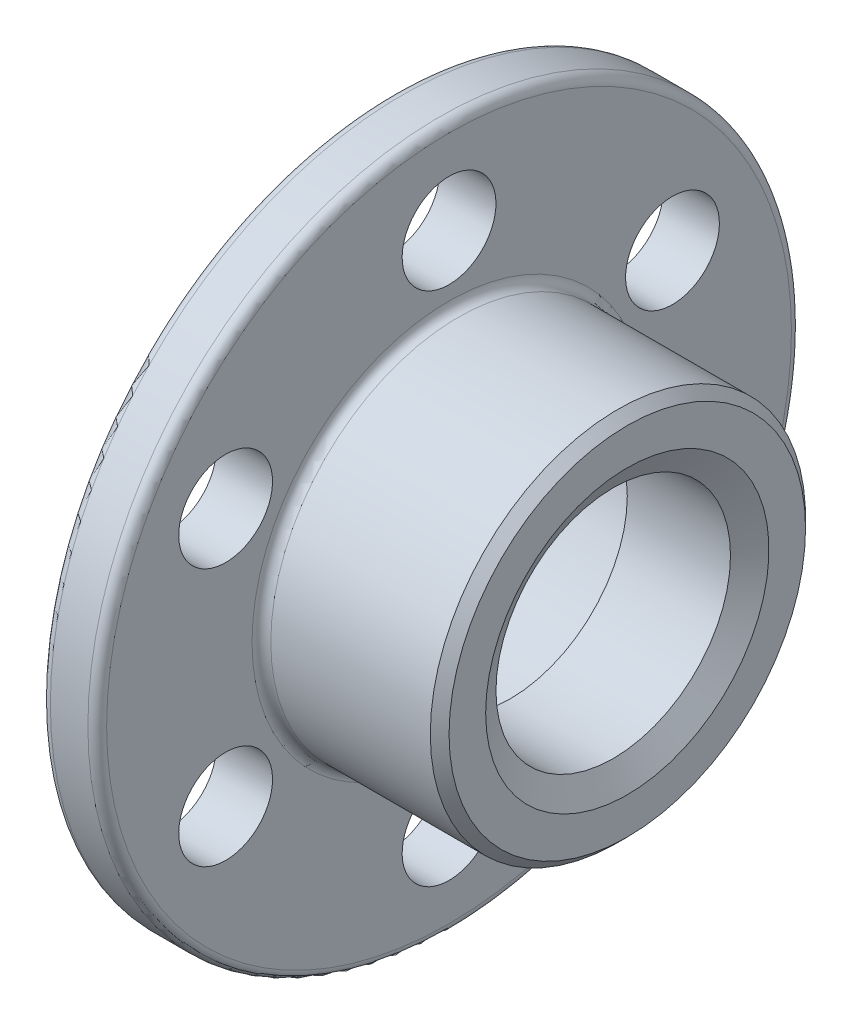
ISO-10303-21;
HEADER;
FILE_DESCRIPTION(('STEP AP214'),'2;1');
FILE_NAME('part.step','',(''),(''),'','','');
FILE_SCHEMA(('AUTOMOTIVE_DESIGN { 1 0 10303 214 1 1 1 1 }'));
ENDSEC;
DATA;
#1=APPLICATION_CONTEXT('core data for automotive mechanical design processes');
#2=APPLICATION_PROTOCOL_DEFINITION('international standard','automotive_design',2000,#1);
#3=PRODUCT_CONTEXT('',#1,'mechanical');
#4=PRODUCT('Part','Part','',(#3));
#5=PRODUCT_RELATED_PRODUCT_CATEGORY('part','',(#4));
#6=PRODUCT_DEFINITION_FORMATION('','',#4);
#7=PRODUCT_DEFINITION_CONTEXT('part definition',#1,'design');
#8=PRODUCT_DEFINITION('design','',#6,#7);
#9=PRODUCT_DEFINITION_SHAPE('','',#8);
#10=(LENGTH_UNIT() NAMED_UNIT(*) SI_UNIT(.MILLI.,.METRE.));
#11=(NAMED_UNIT(*) PLANE_ANGLE_UNIT() SI_UNIT($,.RADIAN.));
#12=(NAMED_UNIT(*) SI_UNIT($,.STERADIAN.) SOLID_ANGLE_UNIT());
#13=UNCERTAINTY_MEASURE_WITH_UNIT(LENGTH_MEASURE(1.E-05),#10,'distance_accuracy_value','');
#14=(GEOMETRIC_REPRESENTATION_CONTEXT(3) GLOBAL_UNCERTAINTY_ASSIGNED_CONTEXT((#13)) GLOBAL_UNIT_ASSIGNED_CONTEXT((#10,
#11,#12)) REPRESENTATION_CONTEXT('',''));
#15=CARTESIAN_POINT('',(0.,0.,0.));
#16=DIRECTION('',(0.,0.,1.));
#17=DIRECTION('',(1.,0.,0.));
#18=AXIS2_PLACEMENT_3D('',#15,#16,#17);
#19=CARTESIAN_POINT('',(0.,75.,0.));
#20=DIRECTION('',(1.,0.,0.));
#21=DIRECTION('',(0.,0.,-1.));
#22=AXIS2_PLACEMENT_3D('',#19,#20,#21);
#23=PLANE('',#22);
#24=CARTESIAN_POINT('',(0.,0.,0.));
#25=DIRECTION('',(1.,0.,0.));
#26=DIRECTION('',(0.,0.,-1.));
#27=AXIS2_PLACEMENT_3D('',#24,#25,#26);
#28=CIRCLE('',#27,73.);
#29=CARTESIAN_POINT('',(0.,0.,-73.));
#30=VERTEX_POINT('',#29);
#31=EDGE_CURVE('E66',#30,#30,#28,.F.);
#32=ORIENTED_EDGE('',*,*,#31,.T.);
#33=EDGE_LOOP('',(#32));
#34=FACE_BOUND('',#33,.T.);
#35=CARTESIAN_POINT('',(0.,-27.4999999999996,47.6313972081444));
#36=DIRECTION('',(-1.,0.,0.));
#37=DIRECTION('',(0.,0.499999999999992,-0.866025403784443));
#38=AXIS2_PLACEMENT_3D('',#35,#36,#37);
#39=CIRCLE('',#38,9.99999999999999);
#40=CARTESIAN_POINT('',(0.,-22.4999999999996,38.9711431703));
#41=VERTEX_POINT('',#40);
#42=EDGE_CURVE('E120',#41,#41,#39,.T.);
#43=ORIENTED_EDGE('',*,*,#42,.F.);
#44=EDGE_LOOP('',(#43));
#45=FACE_BOUND('',#44,.T.);
#46=CARTESIAN_POINT('',(0.,-27.5000000000002,-47.631397208144));
#47=DIRECTION('',(-1.,0.,0.));
#48=DIRECTION('',(0.,0.500000000000004,0.866025403784436));
#49=AXIS2_PLACEMENT_3D('',#46,#47,#48);
#50=CIRCLE('',#49,9.99999999999999);
#51=CARTESIAN_POINT('',(0.,-22.5000000000002,-38.9711431702997));
#52=VERTEX_POINT('',#51);
#53=EDGE_CURVE('E108',#52,#52,#50,.T.);
#54=ORIENTED_EDGE('',*,*,#53,.F.);
#55=EDGE_LOOP('',(#54));
#56=FACE_BOUND('',#55,.T.);
#57=CARTESIAN_POINT('',(0.,55.,0.));
#58=DIRECTION('',(-1.,0.,0.));
#59=DIRECTION('',(0.,-1.,0.));
#60=AXIS2_PLACEMENT_3D('',#57,#58,#59);
#61=CIRCLE('',#60,9.99999999999999);
#62=CARTESIAN_POINT('',(0.,45.,0.));
#63=VERTEX_POINT('',#62);
#64=EDGE_CURVE('E96',#63,#63,#61,.T.);
#65=ORIENTED_EDGE('',*,*,#64,.F.);
#66=EDGE_LOOP('',(#65));
#67=FACE_BOUND('',#66,.T.);
#68=CARTESIAN_POINT('',(0.,0.,0.));
#69=DIRECTION('',(-1.,0.,0.));
#70=DIRECTION('',(0.,0.,1.));
#71=AXIS2_PLACEMENT_3D('',#68,#69,#70);
#72=CIRCLE('',#71,35.);
#73=CARTESIAN_POINT('',(0.,0.,35.));
#74=VERTEX_POINT('',#73);
#75=EDGE_CURVE('E84',#74,#74,#72,.T.);
#76=ORIENTED_EDGE('',*,*,#75,.F.);
#77=EDGE_LOOP('',(#76));
#78=FACE_BOUND('',#77,.T.);
#79=CARTESIAN_POINT('',(0.,27.4999999999999,-47.6313972081442));
#80=DIRECTION('',(-1.,0.,0.));
#81=DIRECTION('',(0.,-0.499999999999998,0.86602540378444));
#82=AXIS2_PLACEMENT_3D('',#79,#80,#81);
#83=CIRCLE('',#82,9.99999999999999);
#84=CARTESIAN_POINT('',(0.,22.4999999999999,-38.9711431702998));
#85=VERTEX_POINT('',#84);
#86=EDGE_CURVE('E102',#85,#85,#83,.T.);
#87=ORIENTED_EDGE('',*,*,#86,.F.);
#88=EDGE_LOOP('',(#87));
#89=FACE_BOUND('',#88,.T.);
#90=CARTESIAN_POINT('',(0.,-55.,0.));
#91=DIRECTION('',(-1.,0.,0.));
#92=DIRECTION('',(0.,1.,0.));
#93=AXIS2_PLACEMENT_3D('',#90,#91,#92);
#94=CIRCLE('',#93,9.99999999999999);
#95=CARTESIAN_POINT('',(0.,-45.,0.));
#96=VERTEX_POINT('',#95);
#97=EDGE_CURVE('E114',#96,#96,#94,.T.);
#98=ORIENTED_EDGE('',*,*,#97,.F.);
#99=EDGE_LOOP('',(#98));
#100=FACE_BOUND('',#99,.T.);
#101=CARTESIAN_POINT('',(0.,27.5000000000006,47.6313972081438));
#102=DIRECTION('',(-1.,0.,0.));
#103=DIRECTION('',(0.,-0.50000000000001,-0.866025403784433));
#104=AXIS2_PLACEMENT_3D('',#101,#102,#103);
#105=CIRCLE('',#104,9.99999999999999);
#106=CARTESIAN_POINT('',(0.,22.5000000000005,38.9711431702995));
#107=VERTEX_POINT('',#106);
#108=EDGE_CURVE('E126',#107,#107,#105,.T.);
#109=ORIENTED_EDGE('',*,*,#108,.F.);
#110=EDGE_LOOP('',(#109));
#111=FACE_BOUND('',#110,.T.);
#112=ADVANCED_FACE('F46',(#34,#45,#56,#67,#78,#89,#100,#111),#23,.F.);
#113=CARTESIAN_POINT('',(12.,40.,0.));
#114=DIRECTION('',(-1.,0.,0.));
#115=DIRECTION('',(0.,0.,1.));
#116=AXIS2_PLACEMENT_3D('',#113,#114,#115);
#117=PLANE('',#116);
#118=CARTESIAN_POINT('',(12.,0.,0.));
#119=DIRECTION('',(-1.,0.,0.));
#120=DIRECTION('',(0.,0.,1.));
#121=AXIS2_PLACEMENT_3D('',#118,#119,#120);
#122=CIRCLE('',#121,42.);
#123=CARTESIAN_POINT('',(12.,0.,42.));
#124=VERTEX_POINT('',#123);
#125=EDGE_CURVE('E78',#124,#124,#122,.T.);
#126=ORIENTED_EDGE('',*,*,#125,.T.);
#127=EDGE_LOOP('',(#126));
#128=FACE_BOUND('',#127,.T.);
#129=CARTESIAN_POINT('',(12.,0.,0.));
#130=DIRECTION('',(-1.,0.,0.));
#131=DIRECTION('',(0.,0.,1.));
#132=AXIS2_PLACEMENT_3D('',#129,#130,#131);
#133=CIRCLE('',#132,73.);
#134=CARTESIAN_POINT('',(12.,0.,73.));
#135=VERTEX_POINT('',#134);
#136=EDGE_CURVE('E81',#135,#135,#133,.F.);
#137=ORIENTED_EDGE('',*,*,#136,.T.);
#138=EDGE_LOOP('',(#137));
#139=FACE_BOUND('',#138,.T.);
#140=CARTESIAN_POINT('',(12.,-27.4999999999996,47.6313972081444));
#141=DIRECTION('',(-1.,0.,0.));
#142=DIRECTION('',(0.,0.499999999999992,-0.866025403784443));
#143=AXIS2_PLACEMENT_3D('',#140,#141,#142);
#144=CIRCLE('',#143,9.99999999999999);
#145=CARTESIAN_POINT('',(12.,-22.4999999999996,38.9711431703));
#146=VERTEX_POINT('',#145);
#147=EDGE_CURVE('E117',#146,#146,#144,.T.);
#148=ORIENTED_EDGE('',*,*,#147,.T.);
#149=EDGE_LOOP('',(#148));
#150=FACE_BOUND('',#149,.T.);
#151=CARTESIAN_POINT('',(12.,-27.5000000000002,-47.631397208144));
#152=DIRECTION('',(-1.,0.,0.));
#153=DIRECTION('',(0.,0.500000000000004,0.866025403784436));
#154=AXIS2_PLACEMENT_3D('',#151,#152,#153);
#155=CIRCLE('',#154,9.99999999999999);
#156=CARTESIAN_POINT('',(12.,-22.5000000000002,-38.9711431702997));
#157=VERTEX_POINT('',#156);
#158=EDGE_CURVE('E105',#157,#157,#155,.T.);
#159=ORIENTED_EDGE('',*,*,#158,.T.);
#160=EDGE_LOOP('',(#159));
#161=FACE_BOUND('',#160,.T.);
#162=CARTESIAN_POINT('',(12.,55.,0.));
#163=DIRECTION('',(-1.,0.,0.));
#164=DIRECTION('',(0.,-1.,0.));
#165=AXIS2_PLACEMENT_3D('',#162,#163,#164);
#166=CIRCLE('',#165,9.99999999999999);
#167=CARTESIAN_POINT('',(12.,45.,0.));
#168=VERTEX_POINT('',#167);
#169=EDGE_CURVE('E93',#168,#168,#166,.T.);
#170=ORIENTED_EDGE('',*,*,#169,.T.);
#171=EDGE_LOOP('',(#170));
#172=FACE_BOUND('',#171,.T.);
#173=CARTESIAN_POINT('',(12.,27.4999999999999,-47.6313972081442));
#174=DIRECTION('',(-1.,0.,0.));
#175=DIRECTION('',(0.,-0.499999999999998,0.86602540378444));
#176=AXIS2_PLACEMENT_3D('',#173,#174,#175);
#177=CIRCLE('',#176,9.99999999999999);
#178=CARTESIAN_POINT('',(12.,22.4999999999999,-38.9711431702998));
#179=VERTEX_POINT('',#178);
#180=EDGE_CURVE('E99',#179,#179,#177,.T.);
#181=ORIENTED_EDGE('',*,*,#180,.T.);
#182=EDGE_LOOP('',(#181));
#183=FACE_BOUND('',#182,.T.);
#184=CARTESIAN_POINT('',(12.,-55.,0.));
#185=DIRECTION('',(-1.,0.,0.));
#186=DIRECTION('',(0.,1.,0.));
#187=AXIS2_PLACEMENT_3D('',#184,#185,#186);
#188=CIRCLE('',#187,9.99999999999999);
#189=CARTESIAN_POINT('',(12.,-45.,0.));
#190=VERTEX_POINT('',#189);
#191=EDGE_CURVE('E111',#190,#190,#188,.T.);
#192=ORIENTED_EDGE('',*,*,#191,.T.);
#193=EDGE_LOOP('',(#192));
#194=FACE_BOUND('',#193,.T.);
#195=CARTESIAN_POINT('',(12.,27.5000000000006,47.6313972081438));
#196=DIRECTION('',(-1.,0.,0.));
#197=DIRECTION('',(0.,-0.50000000000001,-0.866025403784433));
#198=AXIS2_PLACEMENT_3D('',#195,#196,#197);
#199=CIRCLE('',#198,9.99999999999999);
#200=CARTESIAN_POINT('',(12.,22.5000000000005,38.9711431702995));
#201=VERTEX_POINT('',#200);
#202=EDGE_CURVE('E123',#201,#201,#199,.T.);
#203=ORIENTED_EDGE('',*,*,#202,.T.);
#204=EDGE_LOOP('',(#203));
#205=FACE_BOUND('',#204,.T.);
#206=ADVANCED_FACE('F134',(#128,#139,#150,#161,#172,#183,#194,#205),#117,.F.);
#207=CARTESIAN_POINT('',(0.,0.,0.));
#208=DIRECTION('',(-1.,0.,0.));
#209=DIRECTION('',(0.,0.,1.));
#210=AXIS2_PLACEMENT_3D('',#207,#208,#209);
#211=CYLINDRICAL_SURFACE('',#210,35.);
#212=CARTESIAN_POINT('',(25.,0.,0.));
#213=DIRECTION('',(-1.,0.,0.));
#214=DIRECTION('',(0.,0.,1.));
#215=AXIS2_PLACEMENT_3D('',#212,#213,#214);
#216=CIRCLE('',#215,35.);
#217=CARTESIAN_POINT('',(25.,0.,35.));
#218=VERTEX_POINT('',#217);
#219=EDGE_CURVE('E87',#218,#218,#216,.T.);
#220=ORIENTED_EDGE('',*,*,#219,.F.);
#221=EDGE_LOOP('',(#220));
#222=FACE_BOUND('',#221,.T.);
#223=ORIENTED_EDGE('',*,*,#75,.T.);
#224=EDGE_LOOP('',(#223));
#225=FACE_BOUND('',#224,.T.);
#226=ADVANCED_FACE('F140',(#222,#225),#211,.F.);
#227=CARTESIAN_POINT('',(25.,35.,0.));
#228=DIRECTION('',(1.,0.,0.));
#229=DIRECTION('',(0.,0.,-1.));
#230=AXIS2_PLACEMENT_3D('',#227,#228,#229);
#231=PLANE('',#230);
#232=CARTESIAN_POINT('',(25.,0.,0.));
#233=DIRECTION('',(-1.,0.,0.));
#234=DIRECTION('',(0.,0.,1.));
#235=AXIS2_PLACEMENT_3D('',#232,#233,#234);
#236=CIRCLE('',#235,25.);
#237=CARTESIAN_POINT('',(25.,0.,25.));
#238=VERTEX_POINT('',#237);
#239=EDGE_CURVE('E90',#238,#238,#236,.T.);
#240=ORIENTED_EDGE('',*,*,#239,.F.);
#241=EDGE_LOOP('',(#240));
#242=FACE_BOUND('',#241,.T.);
#243=ORIENTED_EDGE('',*,*,#219,.T.);
#244=EDGE_LOOP('',(#243));
#245=FACE_BOUND('',#244,.T.);
#246=ADVANCED_FACE('F224',(#242,#245),#231,.F.);
#247=CARTESIAN_POINT('',(0.,0.,0.));
#248=DIRECTION('',(-1.,0.,0.));
#249=DIRECTION('',(0.,0.,1.));
#250=AXIS2_PLACEMENT_3D('',#247,#248,#249);
#251=CYLINDRICAL_SURFACE('',#250,25.);
#252=CARTESIAN_POINT('',(47.,0.,0.));
#253=DIRECTION('',(-1.,0.,0.));
#254=DIRECTION('',(0.,0.,1.));
#255=AXIS2_PLACEMENT_3D('',#252,#253,#254);
#256=CIRCLE('',#255,25.);
#257=CARTESIAN_POINT('',(47.,0.,25.));
#258=VERTEX_POINT('',#257);
#259=EDGE_CURVE('E12',#258,#258,#256,.F.);
#260=ORIENTED_EDGE('',*,*,#259,.T.);
#261=EDGE_LOOP('',(#260));
#262=FACE_BOUND('',#261,.T.);
#263=ORIENTED_EDGE('',*,*,#239,.T.);
#264=EDGE_LOOP('',(#263));
#265=FACE_BOUND('',#264,.T.);
#266=ADVANCED_FACE('F222',(#262,#265),#251,.F.);
#267=CARTESIAN_POINT('',(50.,25.,0.));
#268=DIRECTION('',(-1.,0.,0.));
#269=DIRECTION('',(0.,0.,1.));
#270=AXIS2_PLACEMENT_3D('',#267,#268,#269);
#271=PLANE('',#270);
#272=CARTESIAN_POINT('',(50.,0.,0.));
#273=DIRECTION('',(-1.,0.,0.));
#274=DIRECTION('',(0.,0.,1.));
#275=AXIS2_PLACEMENT_3D('',#272,#273,#274);
#276=CIRCLE('',#275,30.1961524227067);
#277=CARTESIAN_POINT('',(50.,0.,30.1961524227067));
#278=VERTEX_POINT('',#277);
#279=EDGE_CURVE('E53',#278,#278,#276,.T.);
#280=ORIENTED_EDGE('',*,*,#279,.T.);
#281=EDGE_LOOP('',(#280));
#282=FACE_BOUND('',#281,.T.);
#283=CARTESIAN_POINT('',(50.,0.,0.));
#284=DIRECTION('',(-1.,0.,0.));
#285=DIRECTION('',(0.,0.,1.));
#286=AXIS2_PLACEMENT_3D('',#283,#284,#285);
#287=CIRCLE('',#286,38.);
#288=CARTESIAN_POINT('',(50.,0.,38.));
#289=VERTEX_POINT('',#288);
#290=EDGE_CURVE('E57',#289,#289,#287,.F.);
#291=ORIENTED_EDGE('',*,*,#290,.T.);
#292=EDGE_LOOP('',(#291));
#293=FACE_BOUND('',#292,.T.);
#294=ADVANCED_FACE('F173',(#282,#293),#271,.F.);
#295=CARTESIAN_POINT('',(0.,0.,0.));
#296=DIRECTION('',(-1.,0.,0.));
#297=DIRECTION('',(0.,0.,1.));
#298=AXIS2_PLACEMENT_3D('',#295,#296,#297);
#299=CYLINDRICAL_SURFACE('',#298,40.);
#300=CARTESIAN_POINT('',(48.,0.,0.));
#301=DIRECTION('',(-1.,0.,0.));
#302=DIRECTION('',(0.,0.,1.));
#303=AXIS2_PLACEMENT_3D('',#300,#301,#302);
#304=CIRCLE('',#303,40.);
#305=CARTESIAN_POINT('',(48.,0.,40.));
#306=VERTEX_POINT('',#305);
#307=EDGE_CURVE('E61',#306,#306,#304,.T.);
#308=ORIENTED_EDGE('',*,*,#307,.T.);
#309=EDGE_LOOP('',(#308));
#310=FACE_BOUND('',#309,.T.);
#311=CARTESIAN_POINT('',(14.,0.,0.));
#312=DIRECTION('',(-1.,0.,0.));
#313=DIRECTION('',(0.,0.,1.));
#314=AXIS2_PLACEMENT_3D('',#311,#312,#313);
#315=CIRCLE('',#314,40.);
#316=CARTESIAN_POINT('',(14.,0.,40.));
#317=VERTEX_POINT('',#316);
#318=EDGE_CURVE('E75',#317,#317,#315,.F.);
#319=ORIENTED_EDGE('',*,*,#318,.T.);
#320=EDGE_LOOP('',(#319));
#321=FACE_BOUND('',#320,.T.);
#322=ADVANCED_FACE('F169',(#310,#321),#299,.T.);
#323=CARTESIAN_POINT('',(0.,0.,0.));
#324=DIRECTION('',(-1.,0.,0.));
#325=DIRECTION('',(0.,0.,1.));
#326=AXIS2_PLACEMENT_3D('',#323,#324,#325);
#327=CYLINDRICAL_SURFACE('',#326,75.);
#328=CARTESIAN_POINT('',(10.,0.,0.));
#329=DIRECTION('',(-1.,0.,0.));
#330=DIRECTION('',(0.,0.,1.));
#331=AXIS2_PLACEMENT_3D('',#328,#329,#330);
#332=CIRCLE('',#331,75.);
#333=CARTESIAN_POINT('',(10.,0.,75.));
#334=VERTEX_POINT('',#333);
#335=EDGE_CURVE('E69',#334,#334,#332,.T.);
#336=ORIENTED_EDGE('',*,*,#335,.T.);
#337=EDGE_LOOP('',(#336));
#338=FACE_BOUND('',#337,.T.);
#339=CARTESIAN_POINT('',(2.,0.,0.));
#340=DIRECTION('',(1.,0.,0.));
#341=DIRECTION('',(0.,0.,-1.));
#342=AXIS2_PLACEMENT_3D('',#339,#340,#341);
#343=CIRCLE('',#342,75.);
#344=CARTESIAN_POINT('',(2.,0.,-75.));
#345=VERTEX_POINT('',#344);
#346=EDGE_CURVE('E72',#345,#345,#343,.T.);
#347=ORIENTED_EDGE('',*,*,#346,.T.);
#348=EDGE_LOOP('',(#347));
#349=FACE_BOUND('',#348,.T.);
#350=ADVANCED_FACE('F172',(#338,#349),#327,.T.);
#351=CARTESIAN_POINT('',(12.,55.,0.));
#352=DIRECTION('',(-1.,0.,0.));
#353=DIRECTION('',(0.,-1.,0.));
#354=AXIS2_PLACEMENT_3D('',#351,#352,#353);
#355=CYLINDRICAL_SURFACE('',#354,9.99999999999999);
#356=ORIENTED_EDGE('',*,*,#64,.T.);
#357=EDGE_LOOP('',(#356));
#358=FACE_BOUND('',#357,.T.);
#359=ORIENTED_EDGE('',*,*,#169,.F.);
#360=EDGE_LOOP('',(#359));
#361=FACE_BOUND('',#360,.T.);
#362=ADVANCED_FACE('F212',(#358,#361),#355,.F.);
#363=CARTESIAN_POINT('',(12.,27.4999999999999,-47.6313972081442));
#364=DIRECTION('',(-1.,0.,0.));
#365=DIRECTION('',(0.,-0.499999999999998,0.86602540378444));
#366=AXIS2_PLACEMENT_3D('',#363,#364,#365);
#367=CYLINDRICAL_SURFACE('',#366,9.99999999999999);
#368=ORIENTED_EDGE('',*,*,#86,.T.);
#369=EDGE_LOOP('',(#368));
#370=FACE_BOUND('',#369,.T.);
#371=ORIENTED_EDGE('',*,*,#180,.F.);
#372=EDGE_LOOP('',(#371));
#373=FACE_BOUND('',#372,.T.);
#374=ADVANCED_FACE('F208',(#370,#373),#367,.F.);
#375=CARTESIAN_POINT('',(12.,-27.5000000000002,-47.631397208144));
#376=DIRECTION('',(-1.,0.,0.));
#377=DIRECTION('',(0.,0.500000000000004,0.866025403784436));
#378=AXIS2_PLACEMENT_3D('',#375,#376,#377);
#379=CYLINDRICAL_SURFACE('',#378,9.99999999999999);
#380=ORIENTED_EDGE('',*,*,#53,.T.);
#381=EDGE_LOOP('',(#380));
#382=FACE_BOUND('',#381,.T.);
#383=ORIENTED_EDGE('',*,*,#158,.F.);
#384=EDGE_LOOP('',(#383));
#385=FACE_BOUND('',#384,.T.);
#386=ADVANCED_FACE('F204',(#382,#385),#379,.F.);
#387=CARTESIAN_POINT('',(12.,-55.,0.));
#388=DIRECTION('',(-1.,0.,0.));
#389=DIRECTION('',(0.,1.,0.));
#390=AXIS2_PLACEMENT_3D('',#387,#388,#389);
#391=CYLINDRICAL_SURFACE('',#390,9.99999999999999);
#392=ORIENTED_EDGE('',*,*,#97,.T.);
#393=EDGE_LOOP('',(#392));
#394=FACE_BOUND('',#393,.T.);
#395=ORIENTED_EDGE('',*,*,#191,.F.);
#396=EDGE_LOOP('',(#395));
#397=FACE_BOUND('',#396,.T.);
#398=ADVANCED_FACE('F198',(#394,#397),#391,.F.);
#399=CARTESIAN_POINT('',(12.,-27.4999999999996,47.6313972081444));
#400=DIRECTION('',(-1.,0.,0.));
#401=DIRECTION('',(0.,0.499999999999992,-0.866025403784443));
#402=AXIS2_PLACEMENT_3D('',#399,#400,#401);
#403=CYLINDRICAL_SURFACE('',#402,9.99999999999999);
#404=ORIENTED_EDGE('',*,*,#42,.T.);
#405=EDGE_LOOP('',(#404));
#406=FACE_BOUND('',#405,.T.);
#407=ORIENTED_EDGE('',*,*,#147,.F.);
#408=EDGE_LOOP('',(#407));
#409=FACE_BOUND('',#408,.T.);
#410=ADVANCED_FACE('F193',(#406,#409),#403,.F.);
#411=CARTESIAN_POINT('',(12.,27.5000000000006,47.6313972081438));
#412=DIRECTION('',(-1.,0.,0.));
#413=DIRECTION('',(0.,-0.50000000000001,-0.866025403784433));
#414=AXIS2_PLACEMENT_3D('',#411,#412,#413);
#415=CYLINDRICAL_SURFACE('',#414,9.99999999999999);
#416=ORIENTED_EDGE('',*,*,#108,.T.);
#417=EDGE_LOOP('',(#416));
#418=FACE_BOUND('',#417,.T.);
#419=ORIENTED_EDGE('',*,*,#202,.F.);
#420=EDGE_LOOP('',(#419));
#421=FACE_BOUND('',#420,.T.);
#422=ADVANCED_FACE('F130',(#418,#421),#415,.F.);
#423=CARTESIAN_POINT('',(14.,0.,0.));
#424=DIRECTION('',(-1.,0.,0.));
#425=DIRECTION('',(0.,0.,1.));
#426=AXIS2_PLACEMENT_3D('',#423,#424,#425);
#427=TOROIDAL_SURFACE('',#426,42.,2.);
#428=ORIENTED_EDGE('',*,*,#318,.F.);
#429=EDGE_LOOP('',(#428));
#430=FACE_BOUND('',#429,.T.);
#431=ORIENTED_EDGE('',*,*,#125,.F.);
#432=EDGE_LOOP('',(#431));
#433=FACE_BOUND('',#432,.T.);
#434=ADVANCED_FACE('F147',(#430,#433),#427,.F.);
#435=CARTESIAN_POINT('',(10.,0.,0.));
#436=DIRECTION('',(-1.,0.,0.));
#437=DIRECTION('',(0.,0.,1.));
#438=AXIS2_PLACEMENT_3D('',#435,#436,#437);
#439=TOROIDAL_SURFACE('',#438,73.,2.);
#440=ORIENTED_EDGE('',*,*,#136,.F.);
#441=EDGE_LOOP('',(#440));
#442=FACE_BOUND('',#441,.T.);
#443=ORIENTED_EDGE('',*,*,#335,.F.);
#444=EDGE_LOOP('',(#443));
#445=FACE_BOUND('',#444,.T.);
#446=ADVANCED_FACE('F150',(#442,#445),#439,.T.);
#447=CARTESIAN_POINT('',(2.,0.,0.));
#448=DIRECTION('',(1.,0.,0.));
#449=DIRECTION('',(0.,0.,-1.));
#450=AXIS2_PLACEMENT_3D('',#447,#448,#449);
#451=TOROIDAL_SURFACE('',#450,73.,2.);
#452=ORIENTED_EDGE('',*,*,#346,.F.);
#453=EDGE_LOOP('',(#452));
#454=FACE_BOUND('',#453,.T.);
#455=ORIENTED_EDGE('',*,*,#31,.F.);
#456=EDGE_LOOP('',(#455));
#457=FACE_BOUND('',#456,.T.);
#458=ADVANCED_FACE('F154',(#454,#457),#451,.T.);
#459=CARTESIAN_POINT('',(48.,0.,0.));
#460=DIRECTION('',(-1.,0.,0.));
#461=DIRECTION('',(0.,0.,1.));
#462=AXIS2_PLACEMENT_3D('',#459,#460,#461);
#463=CONICAL_SURFACE('',#462,40.,0.785398163397452);
#464=ORIENTED_EDGE('',*,*,#290,.F.);
#465=EDGE_LOOP('',(#464));
#466=FACE_BOUND('',#465,.T.);
#467=ORIENTED_EDGE('',*,*,#307,.F.);
#468=EDGE_LOOP('',(#467));
#469=FACE_BOUND('',#468,.T.);
#470=ADVANCED_FACE('F157',(#466,#469),#463,.T.);
#471=CARTESIAN_POINT('',(50.,0.,0.));
#472=DIRECTION('',(1.,0.,0.));
#473=DIRECTION('',(0.,0.,-1.));
#474=AXIS2_PLACEMENT_3D('',#471,#472,#473);
#475=CONICAL_SURFACE('',#474,30.1961524227067,1.0471975511966);
#476=ORIENTED_EDGE('',*,*,#259,.F.);
#477=EDGE_LOOP('',(#476));
#478=FACE_BOUND('',#477,.T.);
#479=ORIENTED_EDGE('',*,*,#279,.F.);
#480=EDGE_LOOP('',(#479));
#481=FACE_BOUND('',#480,.T.);
#482=ADVANCED_FACE('F48',(#478,#481),#475,.F.);
#483=CLOSED_SHELL('',(#112,#206,#226,#246,#266,#294,#322,#350,#362,#374,#386,#398,#410,#422,
#434,#446,#458,#470,#482));
#484=MANIFOLD_SOLID_BREP('B2',#483);
#485=ADVANCED_BREP_SHAPE_REPRESENTATION('',(#18,#484),#14);
#486=SHAPE_DEFINITION_REPRESENTATION(#9,#485);
ENDSEC;
END-ISO-10303-21;
